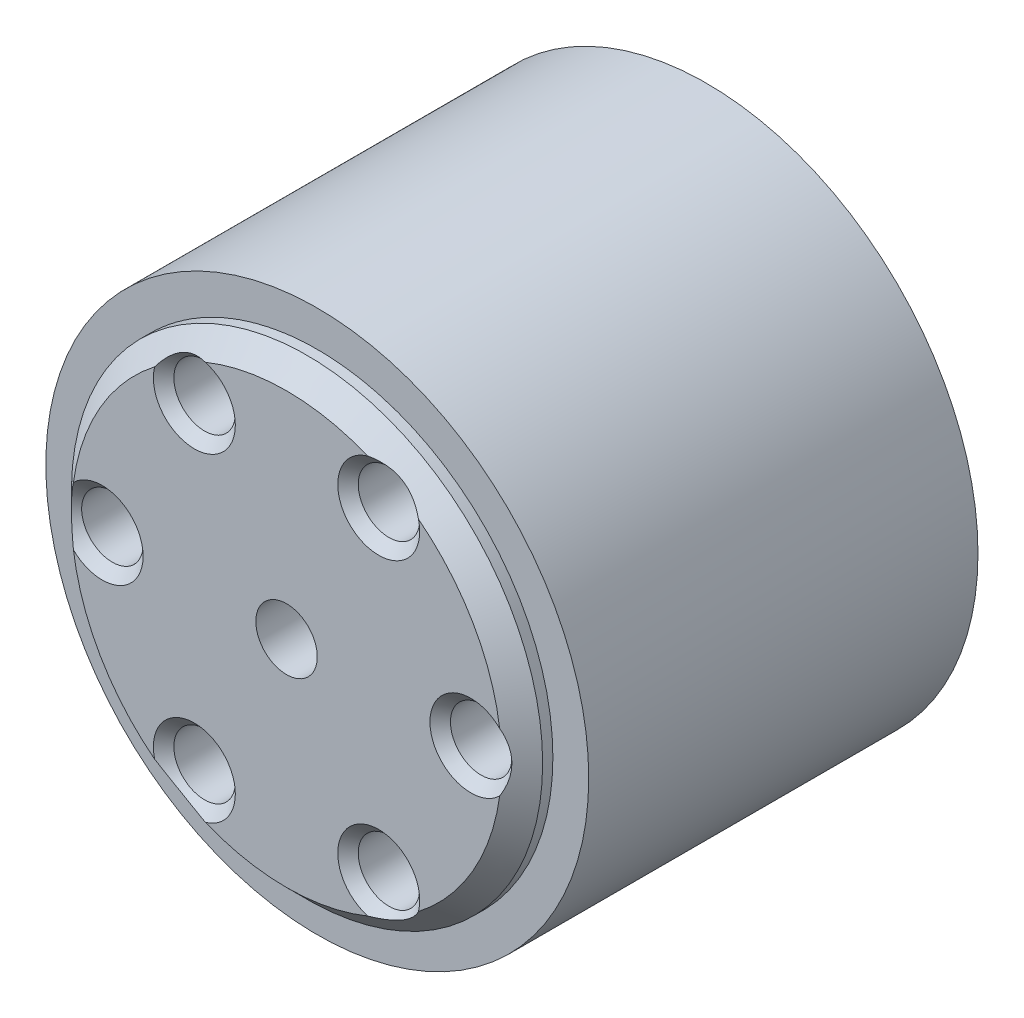
ISO-10303-21;
HEADER;
FILE_DESCRIPTION(('STEP AP214'),'2;1');
FILE_NAME('part.step','',(''),(''),'','','');
FILE_SCHEMA(('AUTOMOTIVE_DESIGN { 1 0 10303 214 1 1 1 1 }'));
ENDSEC;
DATA;
#1=APPLICATION_CONTEXT('core data for automotive mechanical design processes');
#2=APPLICATION_PROTOCOL_DEFINITION('international standard','automotive_design',2000,#1);
#3=PRODUCT_CONTEXT('',#1,'mechanical');
#4=PRODUCT('Part','Part','',(#3));
#5=PRODUCT_RELATED_PRODUCT_CATEGORY('part','',(#4));
#6=PRODUCT_DEFINITION_FORMATION('','',#4);
#7=PRODUCT_DEFINITION_CONTEXT('part definition',#1,'design');
#8=PRODUCT_DEFINITION('design','',#6,#7);
#9=PRODUCT_DEFINITION_SHAPE('','',#8);
#10=(LENGTH_UNIT() NAMED_UNIT(*) SI_UNIT(.MILLI.,.METRE.));
#11=(NAMED_UNIT(*) PLANE_ANGLE_UNIT() SI_UNIT($,.RADIAN.));
#12=(NAMED_UNIT(*) SI_UNIT($,.STERADIAN.) SOLID_ANGLE_UNIT());
#13=UNCERTAINTY_MEASURE_WITH_UNIT(LENGTH_MEASURE(1.E-05),#10,'distance_accuracy_value','');
#14=(GEOMETRIC_REPRESENTATION_CONTEXT(3) GLOBAL_UNCERTAINTY_ASSIGNED_CONTEXT((#13)) GLOBAL_UNIT_ASSIGNED_CONTEXT((#10,
#11,#12)) REPRESENTATION_CONTEXT('',''));
#15=CARTESIAN_POINT('',(0.,0.,0.));
#16=DIRECTION('',(0.,0.,1.));
#17=DIRECTION('',(1.,0.,0.));
#18=AXIS2_PLACEMENT_3D('',#15,#16,#17);
#19=CARTESIAN_POINT('',(0.,0.,9.5));
#20=DIRECTION('',(0.,0.,1.));
#21=DIRECTION('',(1.,0.,0.));
#22=AXIS2_PLACEMENT_3D('',#19,#20,#21);
#23=PLANE('',#22);
#24=CARTESIAN_POINT('',(0.,0.,9.5));
#25=DIRECTION('',(0.,0.,1.));
#26=DIRECTION('',(1.,0.,0.));
#27=AXIS2_PLACEMENT_3D('',#24,#25,#26);
#28=CIRCLE('',#27,13.25);
#29=CARTESIAN_POINT('',(13.25,0.,9.5));
#30=VERTEX_POINT('',#29);
#31=EDGE_CURVE('E11',#30,#30,#28,.T.);
#32=ORIENTED_EDGE('',*,*,#31,.T.);
#33=EDGE_LOOP('',(#32));
#34=FACE_BOUND('',#33,.T.);
#35=CARTESIAN_POINT('',(0.,0.,9.5));
#36=DIRECTION('',(0.,0.,1.));
#37=DIRECTION('',(1.,0.,0.));
#38=AXIS2_PLACEMENT_3D('',#35,#36,#37);
#39=CIRCLE('',#38,11.5);
#40=CARTESIAN_POINT('',(11.5,0.,9.5));
#41=VERTEX_POINT('',#40);
#42=EDGE_CURVE('E55',#41,#41,#39,.T.);
#43=ORIENTED_EDGE('',*,*,#42,.F.);
#44=EDGE_LOOP('',(#43));
#45=FACE_BOUND('',#44,.T.);
#46=ADVANCED_FACE('F44',(#34,#45),#23,.T.);
#47=CARTESIAN_POINT('',(0.,0.,-9.5));
#48=DIRECTION('',(0.,0.,1.));
#49=DIRECTION('',(1.,0.,0.));
#50=AXIS2_PLACEMENT_3D('',#47,#48,#49);
#51=PLANE('',#50);
#52=CARTESIAN_POINT('',(0.,0.,-9.5));
#53=DIRECTION('',(0.,0.,1.));
#54=DIRECTION('',(1.,0.,0.));
#55=AXIS2_PLACEMENT_3D('',#52,#53,#54);
#56=CIRCLE('',#55,13.25);
#57=CARTESIAN_POINT('',(13.25,0.,-9.5));
#58=VERTEX_POINT('',#57);
#59=EDGE_CURVE('E48',#58,#58,#56,.T.);
#60=ORIENTED_EDGE('',*,*,#59,.F.);
#61=EDGE_LOOP('',(#60));
#62=FACE_BOUND('',#61,.T.);
#63=CARTESIAN_POINT('',(0.,0.,-9.5));
#64=DIRECTION('',(0.,0.,1.));
#65=DIRECTION('',(1.,0.,0.));
#66=AXIS2_PLACEMENT_3D('',#63,#64,#65);
#67=CIRCLE('',#66,11.5);
#68=CARTESIAN_POINT('',(11.5,0.,-9.5));
#69=VERTEX_POINT('',#68);
#70=EDGE_CURVE('E57',#69,#69,#67,.T.);
#71=ORIENTED_EDGE('',*,*,#70,.T.);
#72=EDGE_LOOP('',(#71));
#73=FACE_BOUND('',#72,.T.);
#74=ADVANCED_FACE('F67',(#62,#73),#51,.F.);
#75=CARTESIAN_POINT('',(0.,0.,9.5));
#76=DIRECTION('',(0.,0.,-1.));
#77=DIRECTION('',(-1.,0.,0.));
#78=AXIS2_PLACEMENT_3D('',#75,#76,#77);
#79=CYLINDRICAL_SURFACE('',#78,13.25);
#80=ORIENTED_EDGE('',*,*,#31,.F.);
#81=EDGE_LOOP('',(#80));
#82=FACE_BOUND('',#81,.T.);
#83=ORIENTED_EDGE('',*,*,#59,.T.);
#84=EDGE_LOOP('',(#83));
#85=FACE_BOUND('',#84,.T.);
#86=ADVANCED_FACE('F46',(#82,#85),#79,.T.);
#87=CARTESIAN_POINT('',(0.,0.,9.5));
#88=DIRECTION('',(0.,0.,-1.));
#89=DIRECTION('',(-1.,0.,0.));
#90=AXIS2_PLACEMENT_3D('',#87,#88,#89);
#91=CYLINDRICAL_SURFACE('',#90,11.5);
#92=ORIENTED_EDGE('',*,*,#42,.T.);
#93=EDGE_LOOP('',(#92));
#94=FACE_BOUND('',#93,.T.);
#95=ORIENTED_EDGE('',*,*,#70,.F.);
#96=EDGE_LOOP('',(#95));
#97=FACE_BOUND('',#96,.T.);
#98=ADVANCED_FACE('F63',(#94,#97),#91,.F.);
#99=CLOSED_SHELL('',(#46,#74,#86,#98));
#100=MANIFOLD_SOLID_BREP('B2',#99);
#101=CARTESIAN_POINT('',(0.,0.,11.));
#102=DIRECTION('',(0.,0.,-1.));
#103=DIRECTION('',(-1.,0.,0.));
#104=AXIS2_PLACEMENT_3D('',#101,#102,#103);
#105=CYLINDRICAL_SURFACE('',#104,11.5);
#106=CARTESIAN_POINT('',(0.,0.,-10.));
#107=DIRECTION('',(0.,0.,1.));
#108=DIRECTION('',(1.,0.,0.));
#109=AXIS2_PLACEMENT_3D('',#106,#107,#108);
#110=CIRCLE('',#109,11.5);
#111=CARTESIAN_POINT('',(11.5,0.,-10.));
#112=VERTEX_POINT('',#111);
#113=EDGE_CURVE('E263',#112,#112,#110,.T.);
#114=ORIENTED_EDGE('',*,*,#113,.T.);
#115=EDGE_LOOP('',(#114));
#116=FACE_BOUND('',#115,.T.);
#117=CARTESIAN_POINT('',(0.,0.,10.));
#118=DIRECTION('',(0.,0.,1.));
#119=DIRECTION('',(1.,0.,0.));
#120=AXIS2_PLACEMENT_3D('',#117,#118,#119);
#121=CIRCLE('',#120,11.5);
#122=CARTESIAN_POINT('',(11.5,0.,10.));
#123=VERTEX_POINT('',#122);
#124=EDGE_CURVE('E252',#123,#123,#121,.F.);
#125=ORIENTED_EDGE('',*,*,#124,.T.);
#126=EDGE_LOOP('',(#125));
#127=FACE_BOUND('',#126,.T.);
#128=ADVANCED_FACE('F105',(#116,#127),#105,.T.);
#129=CARTESIAN_POINT('',(0.,0.,11.));
#130=DIRECTION('',(0.,0.,1.));
#131=DIRECTION('',(1.,0.,0.));
#132=AXIS2_PLACEMENT_3D('',#129,#130,#131);
#133=PLANE('',#132);
#134=CARTESIAN_POINT('',(0.,0.,11.));
#135=DIRECTION('',(0.,0.,-1.));
#136=DIRECTION('',(-1.,0.,0.));
#137=AXIS2_PLACEMENT_3D('',#134,#135,#136);
#138=CIRCLE('',#137,1.5);
#139=CARTESIAN_POINT('',(-1.5,0.,11.));
#140=VERTEX_POINT('',#139);
#141=EDGE_CURVE('E260',#140,#140,#138,.T.);
#142=ORIENTED_EDGE('',*,*,#141,.T.);
#143=EDGE_LOOP('',(#142));
#144=FACE_BOUND('',#143,.T.);
#145=CARTESIAN_POINT('',(0.,0.,11.));
#146=DIRECTION('',(0.,0.,1.));
#147=DIRECTION('',(1.,0.,0.));
#148=AXIS2_PLACEMENT_3D('',#145,#146,#147);
#149=CIRCLE('',#148,10.5);
#150=CARTESIAN_POINT('',(10.4027777777778,1.42555761236538,11.));
#151=VERTEX_POINT('',#150);
#152=CARTESIAN_POINT('',(6.4359579957557,8.29629101929702,11.));
#153=VERTEX_POINT('',#152);
#154=EDGE_CURVE('E222',#151,#153,#149,.T.);
#155=ORIENTED_EDGE('',*,*,#154,.T.);
#156=CARTESIAN_POINT('',(4.50000000000009,7.79422863405989,11.));
#157=DIRECTION('',(0.,0.,1.));
#158=DIRECTION('',(1.,0.,0.));
#159=AXIS2_PLACEMENT_3D('',#156,#157,#158);
#160=CIRCLE('',#159,2.00000000000002);
#161=CARTESIAN_POINT('',(3.96681978202229,9.72184863166244,11.));
#162=VERTEX_POINT('',#161);
#163=EDGE_CURVE('E402',#153,#162,#160,.F.);
#164=ORIENTED_EDGE('',*,*,#163,.T.);
#165=CARTESIAN_POINT('',(-3.96681978202208,9.72184863166252,11.));
#166=VERTEX_POINT('',#165);
#167=EDGE_CURVE('E270',#162,#166,#149,.T.);
#168=ORIENTED_EDGE('',*,*,#167,.T.);
#169=CARTESIAN_POINT('',(-4.49999999999993,7.79422863405999,11.));
#170=DIRECTION('',(0.,0.,1.));
#171=DIRECTION('',(1.,0.,0.));
#172=AXIS2_PLACEMENT_3D('',#169,#170,#171);
#173=CIRCLE('',#172,2.00000000000002);
#174=CARTESIAN_POINT('',(-6.43595799575553,8.29629101929715,11.));
#175=VERTEX_POINT('',#174);
#176=EDGE_CURVE('E416',#166,#175,#173,.F.);
#177=ORIENTED_EDGE('',*,*,#176,.T.);
#178=CARTESIAN_POINT('',(-10.4027777777778,1.42555761236546,11.));
#179=VERTEX_POINT('',#178);
#180=EDGE_CURVE('E272',#175,#179,#149,.T.);
#181=ORIENTED_EDGE('',*,*,#180,.T.);
#182=CARTESIAN_POINT('',(-9.,0.,11.));
#183=DIRECTION('',(0.,0.,1.));
#184=DIRECTION('',(1.,0.,0.));
#185=AXIS2_PLACEMENT_3D('',#182,#183,#184);
#186=CIRCLE('',#185,2.00000000000002);
#187=CARTESIAN_POINT('',(-10.4027777777778,-1.42555761236531,11.));
#188=VERTEX_POINT('',#187);
#189=EDGE_CURVE('E414',#179,#188,#186,.F.);
#190=ORIENTED_EDGE('',*,*,#189,.T.);
#191=CARTESIAN_POINT('',(-6.43595799575565,-8.29629101929706,11.));
#192=VERTEX_POINT('',#191);
#193=EDGE_CURVE('E693',#188,#192,#149,.T.);
#194=ORIENTED_EDGE('',*,*,#193,.T.);
#195=CARTESIAN_POINT('',(-4.50000000000004,-7.79422863405993,11.));
#196=DIRECTION('',(0.,0.,1.));
#197=DIRECTION('',(1.,0.,0.));
#198=AXIS2_PLACEMENT_3D('',#195,#196,#197);
#199=CIRCLE('',#198,2.00000000000002);
#200=CARTESIAN_POINT('',(-3.96681978202221,-9.72184863166247,11.));
#201=VERTEX_POINT('',#200);
#202=EDGE_CURVE('E411',#192,#201,#199,.F.);
#203=ORIENTED_EDGE('',*,*,#202,.T.);
#204=CARTESIAN_POINT('',(3.96681978202215,-9.72184863166249,11.));
#205=VERTEX_POINT('',#204);
#206=EDGE_CURVE('E691',#201,#205,#149,.T.);
#207=ORIENTED_EDGE('',*,*,#206,.T.);
#208=CARTESIAN_POINT('',(4.49999999999998,-7.79422863405996,11.));
#209=DIRECTION('',(0.,0.,1.));
#210=DIRECTION('',(1.,0.,0.));
#211=AXIS2_PLACEMENT_3D('',#208,#209,#210);
#212=CIRCLE('',#211,2.00000000000002);
#213=CARTESIAN_POINT('',(6.43595799575558,-8.29629101929711,11.));
#214=VERTEX_POINT('',#213);
#215=EDGE_CURVE('E408',#205,#214,#212,.F.);
#216=ORIENTED_EDGE('',*,*,#215,.T.);
#217=CARTESIAN_POINT('',(10.4027777777778,-1.42555761236539,11.));
#218=VERTEX_POINT('',#217);
#219=EDGE_CURVE('E269',#214,#218,#149,.T.);
#220=ORIENTED_EDGE('',*,*,#219,.T.);
#221=CARTESIAN_POINT('',(9.,0.,11.));
#222=DIRECTION('',(0.,0.,1.));
#223=DIRECTION('',(1.,0.,0.));
#224=AXIS2_PLACEMENT_3D('',#221,#222,#223);
#225=CIRCLE('',#224,2.00000000000002);
#226=EDGE_CURVE('E405',#218,#151,#225,.F.);
#227=ORIENTED_EDGE('',*,*,#226,.T.);
#228=EDGE_LOOP('',(#155,#164,#168,#177,#181,#190,#194,#203,#207,#216,#220,#227));
#229=FACE_BOUND('',#228,.T.);
#230=ADVANCED_FACE('F364',(#144,#229),#133,.T.);
#231=CARTESIAN_POINT('',(0.,0.,-11.));
#232=DIRECTION('',(0.,0.,1.));
#233=DIRECTION('',(1.,0.,0.));
#234=AXIS2_PLACEMENT_3D('',#231,#232,#233);
#235=PLANE('',#234);
#236=CARTESIAN_POINT('',(0.,0.,-11.));
#237=DIRECTION('',(0.,0.,-1.));
#238=DIRECTION('',(-1.,0.,0.));
#239=AXIS2_PLACEMENT_3D('',#236,#237,#238);
#240=CIRCLE('',#239,9.);
#241=CARTESIAN_POINT('',(-9.,0.,-11.));
#242=VERTEX_POINT('',#241);
#243=EDGE_CURVE('E256',#242,#242,#240,.T.);
#244=ORIENTED_EDGE('',*,*,#243,.F.);
#245=EDGE_LOOP('',(#244));
#246=FACE_BOUND('',#245,.T.);
#247=CARTESIAN_POINT('',(0.,0.,-11.));
#248=DIRECTION('',(0.,0.,1.));
#249=DIRECTION('',(1.,0.,0.));
#250=AXIS2_PLACEMENT_3D('',#247,#248,#249);
#251=CIRCLE('',#250,10.5);
#252=CARTESIAN_POINT('',(10.5,0.,-11.));
#253=VERTEX_POINT('',#252);
#254=EDGE_CURVE('E266',#253,#253,#251,.F.);
#255=ORIENTED_EDGE('',*,*,#254,.T.);
#256=EDGE_LOOP('',(#255));
#257=FACE_BOUND('',#256,.T.);
#258=ADVANCED_FACE('F369',(#246,#257),#235,.F.);
#259=CARTESIAN_POINT('',(0.,0.,-10.));
#260=DIRECTION('',(0.,0.,1.));
#261=DIRECTION('',(1.,0.,0.));
#262=AXIS2_PLACEMENT_3D('',#259,#260,#261);
#263=CONICAL_SURFACE('',#262,11.5,0.785398163397452);
#264=ORIENTED_EDGE('',*,*,#254,.F.);
#265=EDGE_LOOP('',(#264));
#266=FACE_BOUND('',#265,.T.);
#267=ORIENTED_EDGE('',*,*,#113,.F.);
#268=EDGE_LOOP('',(#267));
#269=FACE_BOUND('',#268,.T.);
#270=ADVANCED_FACE('F302',(#266,#269),#263,.T.);
#271=CARTESIAN_POINT('',(0.,0.,11.));
#272=DIRECTION('',(0.,0.,-1.));
#273=DIRECTION('',(-1.,0.,0.));
#274=AXIS2_PLACEMENT_3D('',#271,#272,#273);
#275=CONICAL_SURFACE('',#274,10.5,0.785398163397447);
#276=ORIENTED_EDGE('',*,*,#124,.F.);
#277=EDGE_LOOP('',(#276));
#278=FACE_BOUND('',#277,.T.);
#279=CARTESIAN_POINT('',(3.96681978202229,9.72184863166244,11.));
#280=CARTESIAN_POINT('',(4.04800281742919,9.71708165853787,10.9737464977825));
#281=CARTESIAN_POINT('',(4.129597876628,9.70947056767909,10.9491180830765));
#282=CARTESIAN_POINT('',(4.29319020898814,9.68814308342982,10.9035233463946));
#283=CARTESIAN_POINT('',(4.37518796533276,9.67441406316904,10.8825647238095));
#284=CARTESIAN_POINT('',(4.53868487648016,9.64047863325514,10.8448658756768));
#285=CARTESIAN_POINT('',(4.62018463735494,9.62028314003418,10.8281186251295));
#286=CARTESIAN_POINT('',(4.78196835962985,9.57317895408099,10.7992477487316));
#287=CARTESIAN_POINT('',(4.86225360244667,9.54627794932121,10.7871188678258));
#288=CARTESIAN_POINT('',(5.01607259250162,9.48750071816903,10.7683938856325));
#289=CARTESIAN_POINT('',(5.08972225209296,9.45602027643994,10.7615092690043));
#290=CARTESIAN_POINT('',(5.23445067103401,9.38720677220278,10.7523148930201));
#291=CARTESIAN_POINT('',(5.30553195692914,9.34987966533036,10.7500005105408));
#292=CARTESIAN_POINT('',(5.4352411310646,9.27499356742143,10.7499995572704));
#293=CARTESIAN_POINT('',(5.49426910837331,9.23812389274586,10.7517391392851));
#294=CARTESIAN_POINT('',(5.60952052427499,9.16048653029115,10.7586584980699));
#295=CARTESIAN_POINT('',(5.66574301539138,9.11971753900176,10.7638394287204));
#296=CARTESIAN_POINT('',(5.77518531628629,9.0345388178329,10.777552394604));
#297=CARTESIAN_POINT('',(5.82839605906454,8.99011898897704,10.786093991054));
#298=CARTESIAN_POINT('',(5.93140703657069,8.89815566987191,10.8063526897249));
#299=CARTESIAN_POINT('',(5.98120634767565,8.85061134045764,10.8180706477018));
#300=CARTESIAN_POINT('',(6.10647601244806,8.72305303763125,10.852511054591));
#301=CARTESIAN_POINT('',(6.17913714882577,8.64087890467324,10.8775917638527));
#302=CARTESIAN_POINT('',(6.28086142669633,8.5139788406267,10.920098072833));
#303=CARTESIAN_POINT('',(6.31348393324186,8.47118656656455,10.9350365919063));
#304=CARTESIAN_POINT('',(6.37642637410579,8.38451771869897,10.9664186584596));
#305=CARTESIAN_POINT('',(6.40674773242467,8.34064183810947,10.9828612610541));
#306=CARTESIAN_POINT('',(6.4359579957557,8.29629101929702,11.));
#307=B_SPLINE_CURVE_WITH_KNOTS('',3,(#279,#280,#281,#282,#283,#284,#285,#286,#287,#288,#289,
#290,#291,#292,#293,#294,#295,#296,#297,#298,#299,#300,#301,#302,#303,#304,#305,#306),
.UNSPECIFIED.,.F.,.F.,(4,2,2,2,2,2,2,2,2,2,2,2,2,4),(0.,0.25638001445752,0.513291643370057,
0.769771831303789,1.02595930250082,1.26676216928416,1.50732132146954,1.71592883040358,
1.92460632052751,2.13388184936356,2.3432138160649,2.67986879906656,2.84734051050619,
3.01470772716207),.UNSPECIFIED.);
#308=EDGE_CURVE('E333',#162,#153,#307,.T.);
#309=ORIENTED_EDGE('',*,*,#308,.T.);
#310=ORIENTED_EDGE('',*,*,#154,.F.);
#311=CARTESIAN_POINT('',(10.4027777777778,1.42555761236538,11.));
#312=CARTESIAN_POINT('',(10.4392409756562,1.35286755478439,10.9737464977825));
#313=CARTESIAN_POINT('',(10.4734471072214,1.27839861526554,10.9491180830765));
#314=CARTESIAN_POINT('',(10.5367731302428,1.12605975745268,10.9035233463946));
#315=CARTESIAN_POINT('',(10.5658823281002,1.04818310727452,10.8825647238095));
#316=CARTESIAN_POINT('',(10.6182418392801,0.889622913823632,10.8448658756768));
#317=CARTESIAN_POINT('',(10.6415019095462,0.808944303893245,10.8281186251295));
#318=CARTESIAN_POINT('',(10.6816003490236,0.645283397507766,10.7992477487316));
#319=CARTESIAN_POINT('',(10.6984460169227,0.562303835299508,10.7871188678258));
#320=CARTESIAN_POINT('',(10.7244529366083,0.39970406675137,10.7683938856325));
#321=CARTESIAN_POINT('',(10.7340149041442,0.320181369700649,10.7615092690043));
#322=CARTESIAN_POINT('',(10.7467848708219,0.160436130129566,10.7523148930201));
#323=CARTESIAN_POINT('',(10.7499992909682,0.0802143773745032,10.7500005105408));
#324=CARTESIAN_POINT('',(10.7500006148565,-0.0695601114851643,10.7499995572704));
#325=CARTESIAN_POINT('',(10.7475845286126,-0.139114676706311,10.7517391392851));
#326=CARTESIAN_POINT('',(10.7379743083948,-0.277744011926639,10.7586584980699));
#327=CARTESIAN_POINT('',(10.7307785718097,-0.346818613142174,10.7638394287204));
#328=CARTESIAN_POINT('',(10.7117327858631,-0.484187786550213,10.777552394604));
#329=CARTESIAN_POINT('',(10.6998694570313,-0.552479555978352,10.786093991054));
#330=CARTESIAN_POINT('',(10.671732375223,-0.687671338919907,10.8063526897249));
#331=CARTESIAN_POINT('',(10.6554574336968,-0.754570972134905,10.8180706477018));
#332=CARTESIAN_POINT('',(10.6076235353717,-0.92683683556457,10.852511054591));
#333=CARTESIAN_POINT('',(10.572789216885,-1.03085029201451,10.8775917638527));
#334=CARTESIAN_POINT('',(10.5137526766141,-1.18239613285532,10.920098072833));
#335=CARTESIAN_POINT('',(10.4930047334633,-1.23204418928995,10.9350365919063));
#336=CARTESIAN_POINT('',(10.449418529927,-1.3298883659871,10.9664186584596));
#337=CARTESIAN_POINT('',(10.4265815818825,-1.37808537286325,10.9828612610541));
#338=CARTESIAN_POINT('',(10.4027777777778,-1.42555761236539,11.));
#339=B_SPLINE_CURVE_WITH_KNOTS('',3,(#311,#312,#313,#314,#315,#316,#317,#318,#319,#320,#321,
#322,#323,#324,#325,#326,#327,#328,#329,#330,#331,#332,#333,#334,#335,#336,#337,#338),
.UNSPECIFIED.,.F.,.F.,(4,2,2,2,2,2,2,2,2,2,2,2,2,4),(0.,0.256380014457518,0.513291643370053,
0.769771831303782,1.02595930250082,1.26676216928415,1.50732132146953,1.71592883040357,
1.9246063205275,2.13388184936355,2.34321381606488,2.67986879906654,2.84734051050617,
3.01470772716206),.UNSPECIFIED.);
#340=EDGE_CURVE('E327',#151,#218,#339,.T.);
#341=ORIENTED_EDGE('',*,*,#340,.T.);
#342=ORIENTED_EDGE('',*,*,#219,.F.);
#343=CARTESIAN_POINT('',(6.43595799575558,-8.29629101929711,11.));
#344=CARTESIAN_POINT('',(6.3912381582271,-8.36421410375354,10.9737464977825));
#345=CARTESIAN_POINT('',(6.34384923059349,-8.43107195241361,10.9491180830765));
#346=CARTESIAN_POINT('',(6.24358292125474,-8.56208332597721,10.9035233463946));
#347=CARTESIAN_POINT('',(6.19069436276752,-8.62623095589458,10.8825647238095));
#348=CARTESIAN_POINT('',(6.07955696280004,-8.75085571943157,10.8448658756768));
#349=CARTESIAN_POINT('',(6.02131727219135,-8.811338836141,10.8281186251295));
#350=CARTESIAN_POINT('',(5.89963198939384,-8.92789555657329,10.7992477487316));
#351=CARTESIAN_POINT('',(5.83619241447613,-8.98397411402177,10.7871188678258));
#352=CARTESIAN_POINT('',(5.70838034410676,-9.08779665141773,10.7683938856325));
#353=CARTESIAN_POINT('',(5.64429265205134,-9.13583890673936,10.7615092690043));
#354=CARTESIAN_POINT('',(5.51233419978801,-9.22677064207329,10.7523148930201));
#355=CARTESIAN_POINT('',(5.44446733403915,-9.26966528795592,10.7500005105408));
#356=CARTESIAN_POINT('',(5.31475948379201,-9.34455367890667,10.7499995572704));
#357=CARTESIAN_POINT('',(5.25331542023933,-9.37723856945225,10.7517391392851));
#358=CARTESIAN_POINT('',(5.1284537841199,-9.43823054221786,10.7586584980699));
#359=CARTESIAN_POINT('',(5.06503555641843,-9.46653615214402,10.7638394287204));
#360=CARTESIAN_POINT('',(4.93654746957687,-9.5187266043832,10.777552394604));
#361=CARTESIAN_POINT('',(4.87147339796681,-9.54259854495548,10.786093991054));
#362=CARTESIAN_POINT('',(4.74032533865236,-9.5858270087919,10.8063526897249));
#363=CARTESIAN_POINT('',(4.67425108602123,-9.60518231259263,10.8180706477018));
#364=CARTESIAN_POINT('',(4.50114752292374,-9.6498898731959,10.852511054591));
#365=CARTESIAN_POINT('',(4.39365206805929,-9.67172919668784,10.8775917638527));
#366=CARTESIAN_POINT('',(4.23289124991783,-9.6963749734821,10.920098072833));
#367=CARTESIAN_POINT('',(4.17952080022154,-9.70323075585458,10.9350365919063));
#368=CARTESIAN_POINT('',(4.07299215582125,-9.71440608468615,10.9664186584596));
#369=CARTESIAN_POINT('',(4.01983384945789,-9.7187272109728,10.9828612610541));
#370=CARTESIAN_POINT('',(3.96681978202215,-9.72184863166249,11.));
#371=B_SPLINE_CURVE_WITH_KNOTS('',3,(#343,#344,#345,#346,#347,#348,#349,#350,#351,#352,#353,
#354,#355,#356,#357,#358,#359,#360,#361,#362,#363,#364,#365,#366,#367,#368,#369,#370),
.UNSPECIFIED.,.F.,.F.,(4,2,2,2,2,2,2,2,2,2,2,2,2,4),(0.,0.256380014457517,0.513291643370051,
0.76977183130378,1.02595930250082,1.26676216928415,1.50732132146953,1.71592883040358,
1.9246063205275,2.13388184936355,2.34321381606488,2.67986879906655,2.84734051050618,
3.01470772716207),.UNSPECIFIED.);
#372=EDGE_CURVE('E320',#214,#205,#371,.T.);
#373=ORIENTED_EDGE('',*,*,#372,.T.);
#374=ORIENTED_EDGE('',*,*,#206,.F.);
#375=CARTESIAN_POINT('',(-3.96681978202222,-9.72184863166247,11.));
#376=CARTESIAN_POINT('',(-4.04800281742912,-9.7170816585379,10.9737464977825));
#377=CARTESIAN_POINT('',(-4.12959787662793,-9.70947056767912,10.9491180830765));
#378=CARTESIAN_POINT('',(-4.29319020898807,-9.68814308342986,10.9035233463946));
#379=CARTESIAN_POINT('',(-4.37518796533268,-9.67441406316907,10.8825647238095));
#380=CARTESIAN_POINT('',(-4.53868487648009,-9.64047863325518,10.8448658756768));
#381=CARTESIAN_POINT('',(-4.62018463735486,-9.62028314003422,10.8281186251295));
#382=CARTESIAN_POINT('',(-4.78196835962978,-9.57317895408103,10.7992477487316));
#383=CARTESIAN_POINT('',(-4.8622536024466,-9.54627794932125,10.7871188678258));
#384=CARTESIAN_POINT('',(-5.01607259250155,-9.48750071816907,10.7683938856325));
#385=CARTESIAN_POINT('',(-5.08972225209289,-9.45602027643998,10.7615092690043));
#386=CARTESIAN_POINT('',(-5.23445067103394,-9.38720677220282,10.7523148930201));
#387=CARTESIAN_POINT('',(-5.30553195692907,-9.34987966533039,10.7500005105408));
#388=CARTESIAN_POINT('',(-5.43524113106453,-9.27499356742147,10.7499995572704));
#389=CARTESIAN_POINT('',(-5.49426910837325,-9.2381238927459,10.7517391392851));
#390=CARTESIAN_POINT('',(-5.60952052427492,-9.16048653029119,10.7586584980699));
#391=CARTESIAN_POINT('',(-5.66574301539132,-9.11971753900181,10.7638394287204));
#392=CARTESIAN_POINT('',(-5.77518531628622,-9.03453881783295,10.777552394604));
#393=CARTESIAN_POINT('',(-5.82839605906448,-8.99011898897709,10.786093991054));
#394=CARTESIAN_POINT('',(-5.93140703657063,-8.89815566987196,10.8063526897249));
#395=CARTESIAN_POINT('',(-5.98120634767559,-8.85061134045769,10.8180706477018));
#396=CARTESIAN_POINT('',(-6.106476012448,-8.72305303763129,10.852511054591));
#397=CARTESIAN_POINT('',(-6.1791371488257,-8.64087890467329,10.8775917638527));
#398=CARTESIAN_POINT('',(-6.28086142669627,-8.51397884062674,10.920098072833));
#399=CARTESIAN_POINT('',(-6.3134839332418,-8.47118656656459,10.9350365919062));
#400=CARTESIAN_POINT('',(-6.37642637410573,-8.38451771869901,10.9664186584596));
#401=CARTESIAN_POINT('',(-6.40674773242461,-8.34064183810951,10.9828612610541));
#402=CARTESIAN_POINT('',(-6.43595799575565,-8.29629101929706,11.));
#403=B_SPLINE_CURVE_WITH_KNOTS('',3,(#375,#376,#377,#378,#379,#380,#381,#382,#383,#384,#385,
#386,#387,#388,#389,#390,#391,#392,#393,#394,#395,#396,#397,#398,#399,#400,#401,#402),
.UNSPECIFIED.,.F.,.F.,(4,2,2,2,2,2,2,2,2,2,2,2,2,4),(0.,0.25638001445752,0.513291643370058,
0.769771831303789,1.02595930250083,1.26676216928416,1.50732132146954,1.71592883040359,
1.92460632052752,2.13388184936356,2.3432138160649,2.67986879906656,2.84734051050619,
3.01470772716208),.UNSPECIFIED.);
#404=EDGE_CURVE('E313',#201,#192,#403,.T.);
#405=ORIENTED_EDGE('',*,*,#404,.T.);
#406=ORIENTED_EDGE('',*,*,#193,.F.);
#407=CARTESIAN_POINT('',(-10.4027777777778,-1.42555761236531,11.));
#408=CARTESIAN_POINT('',(-10.4392409756562,-1.35286755478431,10.9737464977825));
#409=CARTESIAN_POINT('',(-10.4734471072214,-1.27839861526547,10.9491180830765));
#410=CARTESIAN_POINT('',(-10.5367731302428,-1.12605975745261,10.9035233463946));
#411=CARTESIAN_POINT('',(-10.5658823281002,-1.04818310727445,10.8825647238095));
#412=CARTESIAN_POINT('',(-10.6182418392801,-0.889622913823561,10.8448658756768));
#413=CARTESIAN_POINT('',(-10.6415019095462,-0.808944303893173,10.8281186251295));
#414=CARTESIAN_POINT('',(-10.6816003490236,-0.645283397507695,10.7992477487316));
#415=CARTESIAN_POINT('',(-10.6984460169227,-0.562303835299437,10.7871188678258));
#416=CARTESIAN_POINT('',(-10.7244529366083,-0.399704066751298,10.7683938856325));
#417=CARTESIAN_POINT('',(-10.7340149041442,-0.320181369700576,10.7615092690043));
#418=CARTESIAN_POINT('',(-10.7467848708219,-0.160436130129493,10.7523148930201));
#419=CARTESIAN_POINT('',(-10.7499992909682,-0.0802143773744297,10.7500005105408));
#420=CARTESIAN_POINT('',(-10.7500006148565,0.069560111485238,10.7499995572704));
#421=CARTESIAN_POINT('',(-10.7475845286126,0.139114676706385,10.7517391392851));
#422=CARTESIAN_POINT('',(-10.7379743083948,0.277744011926712,10.7586584980699));
#423=CARTESIAN_POINT('',(-10.7307785718097,0.346818613142248,10.7638394287204));
#424=CARTESIAN_POINT('',(-10.7117327858631,0.484187786550287,10.777552394604));
#425=CARTESIAN_POINT('',(-10.6998694570313,0.552479555978426,10.786093991054));
#426=CARTESIAN_POINT('',(-10.671732375223,0.687671338919981,10.8063526897249));
#427=CARTESIAN_POINT('',(-10.6554574336968,0.754570972134978,10.8180706477018));
#428=CARTESIAN_POINT('',(-10.6076235353717,0.926836835564643,10.852511054591));
#429=CARTESIAN_POINT('',(-10.572789216885,1.03085029201458,10.8775917638527));
#430=CARTESIAN_POINT('',(-10.5137526766141,1.18239613285539,10.920098072833));
#431=CARTESIAN_POINT('',(-10.4930047334633,1.23204418929002,10.9350365919063));
#432=CARTESIAN_POINT('',(-10.4494185299269,1.32988836598717,10.9664186584596));
#433=CARTESIAN_POINT('',(-10.4265815818825,1.37808537286332,10.9828612610541));
#434=CARTESIAN_POINT('',(-10.4027777777778,1.42555761236546,11.));
#435=B_SPLINE_CURVE_WITH_KNOTS('',3,(#407,#408,#409,#410,#411,#412,#413,#414,#415,#416,#417,
#418,#419,#420,#421,#422,#423,#424,#425,#426,#427,#428,#429,#430,#431,#432,#433,#434),
.UNSPECIFIED.,.F.,.F.,(4,2,2,2,2,2,2,2,2,2,2,2,2,4),(0.,0.256380014457518,0.513291643370053,
0.769771831303781,1.02595930250082,1.26676216928415,1.50732132146953,1.71592883040357,
1.9246063205275,2.13388184936355,2.34321381606488,2.67986879906654,2.84734051050617,
3.01470772716206),.UNSPECIFIED.);
#436=EDGE_CURVE('E291',#188,#179,#435,.T.);
#437=ORIENTED_EDGE('',*,*,#436,.T.);
#438=ORIENTED_EDGE('',*,*,#180,.F.);
#439=CARTESIAN_POINT('',(-6.43595799575553,8.29629101929715,11.));
#440=CARTESIAN_POINT('',(-6.39123815822705,8.36421410375358,10.9737464977825));
#441=CARTESIAN_POINT('',(-6.34384923059343,8.43107195241365,10.9491180830765));
#442=CARTESIAN_POINT('',(-6.24358292125469,8.56208332597724,10.9035233463946));
#443=CARTESIAN_POINT('',(-6.19069436276747,8.62623095589462,10.8825647238095));
#444=CARTESIAN_POINT('',(-6.07955696279998,8.75085571943161,10.8448658756768));
#445=CARTESIAN_POINT('',(-6.02131727219129,8.81133883614104,10.8281186251295));
#446=CARTESIAN_POINT('',(-5.89963198939378,8.92789555657333,10.7992477487316));
#447=CARTESIAN_POINT('',(-5.83619241447608,8.98397411402181,10.7871188678258));
#448=CARTESIAN_POINT('',(-5.70838034410671,9.08779665141777,10.7683938856325));
#449=CARTESIAN_POINT('',(-5.64429265205129,9.1358389067394,10.7615092690043));
#450=CARTESIAN_POINT('',(-5.51233419978796,9.22677064207333,10.7523148930201));
#451=CARTESIAN_POINT('',(-5.44446733403909,9.26966528795596,10.7500005105408));
#452=CARTESIAN_POINT('',(-5.31475948379194,9.34455367890671,10.7499995572704));
#453=CARTESIAN_POINT('',(-5.25331542023927,9.37723856945229,10.7517391392851));
#454=CARTESIAN_POINT('',(-5.12845378411984,9.43823054221791,10.7586584980699));
#455=CARTESIAN_POINT('',(-5.06503555641837,9.46653615214406,10.7638394287204));
#456=CARTESIAN_POINT('',(-4.93654746957681,9.51872660438323,10.777552394604));
#457=CARTESIAN_POINT('',(-4.87147339796675,9.54259854495551,10.786093991054));
#458=CARTESIAN_POINT('',(-4.7403253386523,9.58582700879194,10.8063526897249));
#459=CARTESIAN_POINT('',(-4.67425108602116,9.60518231259267,10.8180706477018));
#460=CARTESIAN_POINT('',(-4.50114752292367,9.64988987319594,10.852511054591));
#461=CARTESIAN_POINT('',(-4.39365206805923,9.67172919668787,10.8775917638527));
#462=CARTESIAN_POINT('',(-4.23289124991776,9.69637497348213,10.920098072833));
#463=CARTESIAN_POINT('',(-4.17952080022146,9.70323075585461,10.9350365919062));
#464=CARTESIAN_POINT('',(-4.07299215582118,9.71440608468618,10.9664186584596));
#465=CARTESIAN_POINT('',(-4.01983384945782,9.71872721097284,10.9828612610541));
#466=CARTESIAN_POINT('',(-3.96681978202208,9.72184863166252,11.));
#467=B_SPLINE_CURVE_WITH_KNOTS('',3,(#439,#440,#441,#442,#443,#444,#445,#446,#447,#448,#449,
#450,#451,#452,#453,#454,#455,#456,#457,#458,#459,#460,#461,#462,#463,#464,#465,#466),
.UNSPECIFIED.,.F.,.F.,(4,2,2,2,2,2,2,2,2,2,2,2,2,4),(0.,0.256380014457521,0.513291643370058,
0.769771831303788,1.02595930250082,1.26676216928416,1.50732132146954,1.71592883040359,
1.92460632052752,2.13388184936357,2.3432138160649,2.67986879906656,2.8473405105062,
3.01470772716209),.UNSPECIFIED.);
#468=EDGE_CURVE('E284',#175,#166,#467,.T.);
#469=ORIENTED_EDGE('',*,*,#468,.T.);
#470=ORIENTED_EDGE('',*,*,#167,.F.);
#471=EDGE_LOOP('',(#309,#310,#341,#342,#373,#374,#405,#406,#437,#438,#469,#470));
#472=FACE_BOUND('',#471,.T.);
#473=ADVANCED_FACE('F297',(#278,#472),#275,.T.);
#474=CARTESIAN_POINT('',(0.,0.,3.5));
#475=DIRECTION('',(0.,0.,-1.));
#476=DIRECTION('',(-1.,0.,0.));
#477=AXIS2_PLACEMENT_3D('',#474,#475,#476);
#478=CYLINDRICAL_SURFACE('',#477,9.);
#479=CARTESIAN_POINT('',(0.,0.,3.5));
#480=DIRECTION('',(0.,0.,-1.));
#481=DIRECTION('',(-1.,0.,0.));
#482=AXIS2_PLACEMENT_3D('',#479,#480,#481);
#483=CIRCLE('',#482,9.);
#484=CARTESIAN_POINT('',(-8.87499999999999,1.49478259288774,3.5));
#485=VERTEX_POINT('',#484);
#486=CARTESIAN_POINT('',(-5.73201969857543,6.93858416214311,3.5));
#487=VERTEX_POINT('',#486);
#488=EDGE_CURVE('E248',#485,#487,#483,.T.);
#489=ORIENTED_EDGE('',*,*,#488,.F.);
#490=CARTESIAN_POINT('',(-8.87500000000001,-1.49478259288761,3.5));
#491=VERTEX_POINT('',#490);
#492=EDGE_CURVE('E259',#491,#485,#483,.T.);
#493=ORIENTED_EDGE('',*,*,#492,.F.);
#494=CARTESIAN_POINT('',(-5.73201969857552,-6.93858416214303,3.5));
#495=VERTEX_POINT('',#494);
#496=EDGE_CURVE('E457',#495,#491,#483,.T.);
#497=ORIENTED_EDGE('',*,*,#496,.F.);
#498=CARTESIAN_POINT('',(-3.14298030142454,-8.43336675503072,3.5));
#499=VERTEX_POINT('',#498);
#500=EDGE_CURVE('E462',#499,#495,#483,.T.);
#501=ORIENTED_EDGE('',*,*,#500,.F.);
#502=CARTESIAN_POINT('',(3.14298030142449,-8.43336675503073,3.5));
#503=VERTEX_POINT('',#502);
#504=EDGE_CURVE('E238',#503,#499,#483,.T.);
#505=ORIENTED_EDGE('',*,*,#504,.F.);
#506=CARTESIAN_POINT('',(5.73201969857548,-6.93858416214307,3.5));
#507=VERTEX_POINT('',#506);
#508=EDGE_CURVE('E227',#507,#503,#483,.T.);
#509=ORIENTED_EDGE('',*,*,#508,.F.);
#510=CARTESIAN_POINT('',(8.875,-1.49478259288767,3.5));
#511=VERTEX_POINT('',#510);
#512=EDGE_CURVE('E236',#511,#507,#483,.T.);
#513=ORIENTED_EDGE('',*,*,#512,.F.);
#514=CARTESIAN_POINT('',(8.875,1.49478259288767,3.5));
#515=VERTEX_POINT('',#514);
#516=EDGE_CURVE('E244',#515,#511,#483,.T.);
#517=ORIENTED_EDGE('',*,*,#516,.F.);
#518=CARTESIAN_POINT('',(6.11021482053672,6.60797055433008,3.5));
#519=VERTEX_POINT('',#518);
#520=EDGE_CURVE('E246',#519,#515,#483,.T.);
#521=ORIENTED_EDGE('',*,*,#520,.F.);
#522=CARTESIAN_POINT('',(6.11021482053672,6.60797055433008,3.5));
#523=CARTESIAN_POINT('',(6.04867758304427,6.66486962347425,3.58327625945298));
#524=CARTESIAN_POINT('',(5.98639270363181,6.7208702924461,3.66658105649593));
#525=CARTESIAN_POINT('',(5.86032766293149,6.83107482832773,3.83324772316438));
#526=CARTESIAN_POINT('',(5.79654750169023,6.88527869529352,3.91660959278811));
#527=CARTESIAN_POINT('',(5.73201969857558,6.93858416214299,4.00000000000002));
#528=B_SPLINE_CURVE_WITH_KNOTS('',3,(#522,#523,#524,#525,#526,#527),.UNSPECIFIED.,.F.,.F.,(4,2,
4),(0.,0.354396011619444,0.708792012192983),.UNSPECIFIED.);
#529=CARTESIAN_POINT('',(5.73201969857558,6.93858416214299,4.00000000000002));
#530=VERTEX_POINT('',#529);
#531=EDGE_CURVE('E42',#519,#530,#528,.T.);
#532=ORIENTED_EDGE('',*,*,#531,.T.);
#533=DIRECTION('',(0.,0.,-1.));
#534=VECTOR('',#533,1.);
#535=CARTESIAN_POINT('',(5.73201969857558,6.93858416214299,3.5));
#536=LINE('',#535,#534);
#537=CARTESIAN_POINT('',(5.73201969857558,6.93858416214299,3.5));
#538=VERTEX_POINT('',#537);
#539=EDGE_CURVE('E126',#538,#530,#536,.F.);
#540=ORIENTED_EDGE('',*,*,#539,.F.);
#541=CARTESIAN_POINT('',(3.1429803014246,8.43336675503069,3.5));
#542=VERTEX_POINT('',#541);
#543=EDGE_CURVE('E247',#542,#538,#483,.T.);
#544=ORIENTED_EDGE('',*,*,#543,.F.);
#545=DIRECTION('',(0.,0.,-1.));
#546=VECTOR('',#545,1.);
#547=CARTESIAN_POINT('',(3.1429803014246,8.43336675503069,4.00000000000002));
#548=LINE('',#547,#546);
#549=CARTESIAN_POINT('',(3.1429803014246,8.43336675503069,4.00000000000002));
#550=VERTEX_POINT('',#549);
#551=EDGE_CURVE('E279',#550,#542,#548,.T.);
#552=ORIENTED_EDGE('',*,*,#551,.F.);
#553=CARTESIAN_POINT('',(3.1429803014246,8.43336675503069,4.00000000000002));
#554=CARTESIAN_POINT('',(3.06455251141504,8.46259673835365,3.91660959278811));
#555=CARTESIAN_POINT('',(2.98572050501869,8.49073004476316,3.83324772316438));
#556=CARTESIAN_POINT('',(2.82724805698276,8.54480330459794,3.66658105649593));
#557=CARTESIAN_POINT('',(2.74760761531799,8.57074325795486,3.58327625945298));
#558=CARTESIAN_POINT('',(2.66756295724123,8.59558653432995,3.5));
#559=B_SPLINE_CURVE_WITH_KNOTS('',3,(#553,#554,#555,#556,#557,#558),.UNSPECIFIED.,.F.,.F.,(4,2,
4),(0.,0.354396000573539,0.708792012192983),.UNSPECIFIED.);
#560=CARTESIAN_POINT('',(2.66756295724123,8.59558653432995,3.5));
#561=VERTEX_POINT('',#560);
#562=EDGE_CURVE('E120',#550,#561,#559,.T.);
#563=ORIENTED_EDGE('',*,*,#562,.T.);
#564=CARTESIAN_POINT('',(-3.14298030142443,8.43336675503076,3.5));
#565=VERTEX_POINT('',#564);
#566=EDGE_CURVE('E455',#565,#561,#483,.T.);
#567=ORIENTED_EDGE('',*,*,#566,.F.);
#568=EDGE_CURVE('E253',#487,#565,#483,.T.);
#569=ORIENTED_EDGE('',*,*,#568,.F.);
#570=EDGE_LOOP('',(#489,#493,#497,#501,#505,#509,#513,#517,#521,#532,#540,#544,#552,#563,#567,#569));
#571=FACE_BOUND('',#570,.T.);
#572=ORIENTED_EDGE('',*,*,#243,.T.);
#573=EDGE_LOOP('',(#572));
#574=FACE_BOUND('',#573,.T.);
#575=ADVANCED_FACE('F233',(#571,#574),#478,.F.);
#576=CARTESIAN_POINT('',(0.,0.,3.5));
#577=DIRECTION('',(0.,0.,-1.));
#578=DIRECTION('',(-1.,0.,0.));
#579=AXIS2_PLACEMENT_3D('',#576,#577,#578);
#580=PLANE('',#579);
#581=ORIENTED_EDGE('',*,*,#566,.T.);
#582=CARTESIAN_POINT('',(4.50000000000009,7.79422863405989,3.5));
#583=DIRECTION('',(0.,0.,-1.));
#584=DIRECTION('',(-1.,0.,0.));
#585=AXIS2_PLACEMENT_3D('',#582,#583,#584);
#586=CIRCLE('',#585,2.00000000000002);
#587=EDGE_CURVE('E134',#561,#519,#586,.F.);
#588=ORIENTED_EDGE('',*,*,#587,.T.);
#589=ORIENTED_EDGE('',*,*,#520,.T.);
#590=CARTESIAN_POINT('',(9.,0.,3.5));
#591=DIRECTION('',(0.,0.,-1.));
#592=DIRECTION('',(-1.,0.,0.));
#593=AXIS2_PLACEMENT_3D('',#590,#591,#592);
#594=CIRCLE('',#593,1.5);
#595=EDGE_CURVE('E221',#511,#515,#594,.T.);
#596=ORIENTED_EDGE('',*,*,#595,.F.);
#597=ORIENTED_EDGE('',*,*,#512,.T.);
#598=CARTESIAN_POINT('',(4.49999999999998,-7.79422863405996,3.5));
#599=DIRECTION('',(0.,0.,-1.));
#600=DIRECTION('',(-1.,0.,0.));
#601=AXIS2_PLACEMENT_3D('',#598,#599,#600);
#602=CIRCLE('',#601,1.5);
#603=EDGE_CURVE('E213',#503,#507,#602,.T.);
#604=ORIENTED_EDGE('',*,*,#603,.F.);
#605=ORIENTED_EDGE('',*,*,#504,.T.);
#606=CARTESIAN_POINT('',(-4.50000000000004,-7.79422863405993,3.5));
#607=DIRECTION('',(0.,0.,-1.));
#608=DIRECTION('',(-1.,0.,0.));
#609=AXIS2_PLACEMENT_3D('',#606,#607,#608);
#610=CIRCLE('',#609,1.5);
#611=EDGE_CURVE('E229',#499,#495,#610,.F.);
#612=ORIENTED_EDGE('',*,*,#611,.T.);
#613=ORIENTED_EDGE('',*,*,#496,.T.);
#614=CARTESIAN_POINT('',(-9.,0.,3.5));
#615=DIRECTION('',(0.,0.,-1.));
#616=DIRECTION('',(-1.,0.,0.));
#617=AXIS2_PLACEMENT_3D('',#614,#615,#616);
#618=CIRCLE('',#617,1.5);
#619=EDGE_CURVE('E477',#491,#485,#618,.F.);
#620=ORIENTED_EDGE('',*,*,#619,.T.);
#621=ORIENTED_EDGE('',*,*,#488,.T.);
#622=CARTESIAN_POINT('',(-4.49999999999993,7.79422863405999,3.5));
#623=DIRECTION('',(0.,0.,-1.));
#624=DIRECTION('',(-1.,0.,0.));
#625=AXIS2_PLACEMENT_3D('',#622,#623,#624);
#626=CIRCLE('',#625,1.5);
#627=EDGE_CURVE('E475',#487,#565,#626,.F.);
#628=ORIENTED_EDGE('',*,*,#627,.T.);
#629=EDGE_LOOP('',(#581,#588,#589,#596,#597,#604,#605,#612,#613,#620,#621,#628));
#630=FACE_BOUND('',#629,.T.);
#631=CARTESIAN_POINT('',(0.,0.,3.5));
#632=DIRECTION('',(0.,0.,-1.));
#633=DIRECTION('',(-1.,0.,0.));
#634=AXIS2_PLACEMENT_3D('',#631,#632,#633);
#635=CIRCLE('',#634,1.5);
#636=CARTESIAN_POINT('',(-1.5,0.,3.5));
#637=VERTEX_POINT('',#636);
#638=EDGE_CURVE('E254',#637,#637,#635,.T.);
#639=ORIENTED_EDGE('',*,*,#638,.F.);
#640=EDGE_LOOP('',(#639));
#641=FACE_BOUND('',#640,.T.);
#642=ADVANCED_FACE('F241',(#630,#641),#580,.T.);
#643=CARTESIAN_POINT('',(0.,0.,11.));
#644=DIRECTION('',(0.,0.,-1.));
#645=DIRECTION('',(-1.,0.,0.));
#646=AXIS2_PLACEMENT_3D('',#643,#644,#645);
#647=CYLINDRICAL_SURFACE('',#646,1.5);
#648=ORIENTED_EDGE('',*,*,#141,.F.);
#649=EDGE_LOOP('',(#648));
#650=FACE_BOUND('',#649,.T.);
#651=ORIENTED_EDGE('',*,*,#638,.T.);
#652=EDGE_LOOP('',(#651));
#653=FACE_BOUND('',#652,.T.);
#654=ADVANCED_FACE('F510',(#650,#653),#647,.F.);
#655=CARTESIAN_POINT('',(0.,0.,3.5));
#656=DIRECTION('',(0.,0.,-1.));
#657=DIRECTION('',(-1.,0.,0.));
#658=AXIS2_PLACEMENT_3D('',#655,#656,#657);
#659=PLANE('',#658);
#660=CARTESIAN_POINT('',(4.49999999999998,-7.79422863405996,3.5));
#661=DIRECTION('',(0.,0.,-1.));
#662=DIRECTION('',(-1.,0.,0.));
#663=AXIS2_PLACEMENT_3D('',#660,#661,#662);
#664=CIRCLE('',#663,1.5);
#665=EDGE_CURVE('E216',#503,#507,#664,.F.);
#666=ORIENTED_EDGE('',*,*,#665,.T.);
#667=ORIENTED_EDGE('',*,*,#508,.T.);
#668=EDGE_LOOP('',(#666,#667));
#669=FACE_BOUND('',#668,.T.);
#670=ADVANCED_FACE('F226',(#669),#659,.F.);
#671=CARTESIAN_POINT('',(4.49999999999998,-7.79422863405996,-0.742640687119283));
#672=DIRECTION('',(0.,0.,1.));
#673=DIRECTION('',(1.,0.,0.));
#674=AXIS2_PLACEMENT_3D('',#671,#672,#673);
#675=CYLINDRICAL_SURFACE('',#674,1.5);
#676=CARTESIAN_POINT('',(4.49999999999998,-7.79422863405996,10.5));
#677=DIRECTION('',(0.,0.,1.));
#678=DIRECTION('',(1.,0.,0.));
#679=AXIS2_PLACEMENT_3D('',#676,#677,#678);
#680=CIRCLE('',#679,1.5);
#681=CARTESIAN_POINT('',(5.99999999999998,-7.79422863405996,10.5));
#682=VERTEX_POINT('',#681);
#683=EDGE_CURVE('E395',#682,#682,#680,.T.);
#684=ORIENTED_EDGE('',*,*,#683,.T.);
#685=EDGE_LOOP('',(#684));
#686=FACE_BOUND('',#685,.T.);
#687=ORIENTED_EDGE('',*,*,#665,.F.);
#688=ORIENTED_EDGE('',*,*,#603,.T.);
#689=EDGE_LOOP('',(#687,#688));
#690=FACE_BOUND('',#689,.T.);
#691=ADVANCED_FACE('F215',(#686,#690),#675,.F.);
#692=CARTESIAN_POINT('',(0.,0.,3.5));
#693=DIRECTION('',(0.,0.,-1.));
#694=DIRECTION('',(-1.,0.,0.));
#695=AXIS2_PLACEMENT_3D('',#692,#693,#694);
#696=PLANE('',#695);
#697=EDGE_CURVE('E469',#495,#499,#610,.F.);
#698=ORIENTED_EDGE('',*,*,#697,.T.);
#699=ORIENTED_EDGE('',*,*,#500,.T.);
#700=EDGE_LOOP('',(#698,#699));
#701=FACE_BOUND('',#700,.T.);
#702=ADVANCED_FACE('F584',(#701),#696,.F.);
#703=CARTESIAN_POINT('',(-4.50000000000004,-7.79422863405993,-0.742640687119283));
#704=DIRECTION('',(0.,0.,1.));
#705=DIRECTION('',(1.,0.,0.));
#706=AXIS2_PLACEMENT_3D('',#703,#704,#705);
#707=CYLINDRICAL_SURFACE('',#706,1.5);
#708=CARTESIAN_POINT('',(-4.50000000000004,-7.79422863405993,10.5));
#709=DIRECTION('',(0.,0.,1.));
#710=DIRECTION('',(1.,0.,0.));
#711=AXIS2_PLACEMENT_3D('',#708,#709,#710);
#712=CIRCLE('',#711,1.5);
#713=CARTESIAN_POINT('',(-3.00000000000004,-7.79422863405993,10.5));
#714=VERTEX_POINT('',#713);
#715=EDGE_CURVE('E392',#714,#714,#712,.T.);
#716=ORIENTED_EDGE('',*,*,#715,.T.);
#717=EDGE_LOOP('',(#716));
#718=FACE_BOUND('',#717,.T.);
#719=ORIENTED_EDGE('',*,*,#611,.F.);
#720=ORIENTED_EDGE('',*,*,#697,.F.);
#721=EDGE_LOOP('',(#719,#720));
#722=FACE_BOUND('',#721,.T.);
#723=ADVANCED_FACE('F578',(#718,#722),#707,.F.);
#724=CARTESIAN_POINT('',(0.,0.,3.5));
#725=DIRECTION('',(0.,0.,-1.));
#726=DIRECTION('',(-1.,0.,0.));
#727=AXIS2_PLACEMENT_3D('',#724,#725,#726);
#728=PLANE('',#727);
#729=EDGE_CURVE('E479',#485,#491,#618,.F.);
#730=ORIENTED_EDGE('',*,*,#729,.T.);
#731=ORIENTED_EDGE('',*,*,#492,.T.);
#732=EDGE_LOOP('',(#730,#731));
#733=FACE_BOUND('',#732,.T.);
#734=ADVANCED_FACE('F508',(#733),#728,.F.);
#735=CARTESIAN_POINT('',(-9.,0.,-0.742640687119283));
#736=DIRECTION('',(0.,0.,1.));
#737=DIRECTION('',(1.,0.,0.));
#738=AXIS2_PLACEMENT_3D('',#735,#736,#737);
#739=CYLINDRICAL_SURFACE('',#738,1.5);
#740=CARTESIAN_POINT('',(-9.,0.,10.5));
#741=DIRECTION('',(0.,0.,1.));
#742=DIRECTION('',(1.,0.,0.));
#743=AXIS2_PLACEMENT_3D('',#740,#741,#742);
#744=CIRCLE('',#743,1.5);
#745=CARTESIAN_POINT('',(-7.5,0.,10.5));
#746=VERTEX_POINT('',#745);
#747=EDGE_CURVE('E389',#746,#746,#744,.T.);
#748=ORIENTED_EDGE('',*,*,#747,.T.);
#749=EDGE_LOOP('',(#748));
#750=FACE_BOUND('',#749,.T.);
#751=ORIENTED_EDGE('',*,*,#619,.F.);
#752=ORIENTED_EDGE('',*,*,#729,.F.);
#753=EDGE_LOOP('',(#751,#752));
#754=FACE_BOUND('',#753,.T.);
#755=ADVANCED_FACE('F505',(#750,#754),#739,.F.);
#756=CARTESIAN_POINT('',(0.,0.,3.5));
#757=DIRECTION('',(0.,0.,-1.));
#758=DIRECTION('',(-1.,0.,0.));
#759=AXIS2_PLACEMENT_3D('',#756,#757,#758);
#760=PLANE('',#759);
#761=EDGE_CURVE('E482',#565,#487,#626,.F.);
#762=ORIENTED_EDGE('',*,*,#761,.T.);
#763=ORIENTED_EDGE('',*,*,#568,.T.);
#764=EDGE_LOOP('',(#762,#763));
#765=FACE_BOUND('',#764,.T.);
#766=ADVANCED_FACE('F494',(#765),#760,.F.);
#767=CARTESIAN_POINT('',(-4.49999999999993,7.79422863405999,-0.742640687119283));
#768=DIRECTION('',(0.,0.,1.));
#769=DIRECTION('',(1.,0.,0.));
#770=AXIS2_PLACEMENT_3D('',#767,#768,#769);
#771=CYLINDRICAL_SURFACE('',#770,1.5);
#772=CARTESIAN_POINT('',(-4.49999999999993,7.79422863405999,10.5));
#773=DIRECTION('',(0.,0.,1.));
#774=DIRECTION('',(1.,0.,0.));
#775=AXIS2_PLACEMENT_3D('',#772,#773,#774);
#776=CIRCLE('',#775,1.5);
#777=CARTESIAN_POINT('',(-2.99999999999993,7.79422863405999,10.5));
#778=VERTEX_POINT('',#777);
#779=EDGE_CURVE('E386',#778,#778,#776,.T.);
#780=ORIENTED_EDGE('',*,*,#779,.T.);
#781=EDGE_LOOP('',(#780));
#782=FACE_BOUND('',#781,.T.);
#783=ORIENTED_EDGE('',*,*,#627,.F.);
#784=ORIENTED_EDGE('',*,*,#761,.F.);
#785=EDGE_LOOP('',(#783,#784));
#786=FACE_BOUND('',#785,.T.);
#787=ADVANCED_FACE('F496',(#782,#786),#771,.F.);
#788=CARTESIAN_POINT('',(0.,0.,3.5));
#789=DIRECTION('',(0.,0.,-1.));
#790=DIRECTION('',(-1.,0.,0.));
#791=AXIS2_PLACEMENT_3D('',#788,#789,#790);
#792=PLANE('',#791);
#793=CARTESIAN_POINT('',(4.50000000000009,7.79422863405989,3.5));
#794=DIRECTION('',(0.,0.,-1.));
#795=DIRECTION('',(-1.,0.,0.));
#796=AXIS2_PLACEMENT_3D('',#793,#794,#795);
#797=CIRCLE('',#796,1.5);
#798=EDGE_CURVE('E492',#538,#542,#797,.F.);
#799=ORIENTED_EDGE('',*,*,#798,.T.);
#800=ORIENTED_EDGE('',*,*,#543,.T.);
#801=EDGE_LOOP('',(#799,#800));
#802=FACE_BOUND('',#801,.T.);
#803=ADVANCED_FACE('F446',(#802),#792,.F.);
#804=CARTESIAN_POINT('',(4.50000000000009,7.79422863405989,-0.742640687119283));
#805=DIRECTION('',(0.,0.,1.));
#806=DIRECTION('',(1.,0.,0.));
#807=AXIS2_PLACEMENT_3D('',#804,#805,#806);
#808=CYLINDRICAL_SURFACE('',#807,1.5);
#809=CARTESIAN_POINT('',(4.50000000000009,7.79422863405989,10.5));
#810=DIRECTION('',(0.,0.,1.));
#811=DIRECTION('',(1.,0.,0.));
#812=AXIS2_PLACEMENT_3D('',#809,#810,#811);
#813=CIRCLE('',#812,1.5);
#814=CARTESIAN_POINT('',(6.00000000000009,7.79422863405989,10.5));
#815=VERTEX_POINT('',#814);
#816=EDGE_CURVE('E281',#815,#815,#813,.T.);
#817=ORIENTED_EDGE('',*,*,#816,.T.);
#818=EDGE_LOOP('',(#817));
#819=FACE_BOUND('',#818,.T.);
#820=CARTESIAN_POINT('',(4.50000000000009,7.79422863405989,4.00000000000002));
#821=DIRECTION('',(0.,0.,-1.));
#822=DIRECTION('',(-1.,0.,0.));
#823=AXIS2_PLACEMENT_3D('',#820,#821,#822);
#824=CIRCLE('',#823,1.5);
#825=EDGE_CURVE('E276',#530,#550,#824,.T.);
#826=ORIENTED_EDGE('',*,*,#825,.T.);
#827=ORIENTED_EDGE('',*,*,#551,.T.);
#828=ORIENTED_EDGE('',*,*,#798,.F.);
#829=ORIENTED_EDGE('',*,*,#539,.T.);
#830=EDGE_LOOP('',(#826,#827,#828,#829));
#831=FACE_BOUND('',#830,.T.);
#832=ADVANCED_FACE('F443',(#819,#831),#808,.F.);
#833=CARTESIAN_POINT('',(0.,0.,3.5));
#834=DIRECTION('',(0.,0.,-1.));
#835=DIRECTION('',(-1.,0.,0.));
#836=AXIS2_PLACEMENT_3D('',#833,#834,#835);
#837=PLANE('',#836);
#838=CARTESIAN_POINT('',(9.,0.,3.5));
#839=DIRECTION('',(0.,0.,-1.));
#840=DIRECTION('',(-1.,0.,0.));
#841=AXIS2_PLACEMENT_3D('',#838,#839,#840);
#842=CIRCLE('',#841,1.5);
#843=EDGE_CURVE('E228',#511,#515,#842,.F.);
#844=ORIENTED_EDGE('',*,*,#843,.T.);
#845=ORIENTED_EDGE('',*,*,#516,.T.);
#846=EDGE_LOOP('',(#844,#845));
#847=FACE_BOUND('',#846,.T.);
#848=ADVANCED_FACE('F438',(#847),#837,.F.);
#849=CARTESIAN_POINT('',(9.,0.,-0.742640687119283));
#850=DIRECTION('',(0.,0.,1.));
#851=DIRECTION('',(1.,0.,0.));
#852=AXIS2_PLACEMENT_3D('',#849,#850,#851);
#853=CYLINDRICAL_SURFACE('',#852,1.5);
#854=CARTESIAN_POINT('',(9.,0.,10.5));
#855=DIRECTION('',(0.,0.,1.));
#856=DIRECTION('',(1.,0.,0.));
#857=AXIS2_PLACEMENT_3D('',#854,#855,#856);
#858=CIRCLE('',#857,1.5);
#859=CARTESIAN_POINT('',(10.5,0.,10.5));
#860=VERTEX_POINT('',#859);
#861=EDGE_CURVE('E398',#860,#860,#858,.T.);
#862=ORIENTED_EDGE('',*,*,#861,.T.);
#863=EDGE_LOOP('',(#862));
#864=FACE_BOUND('',#863,.T.);
#865=ORIENTED_EDGE('',*,*,#843,.F.);
#866=ORIENTED_EDGE('',*,*,#595,.T.);
#867=EDGE_LOOP('',(#865,#866));
#868=FACE_BOUND('',#867,.T.);
#869=ADVANCED_FACE('F431',(#864,#868),#853,.F.);
#870=CARTESIAN_POINT('',(4.50000000000009,7.79422863405989,10.5));
#871=DIRECTION('',(0.,0.,1.));
#872=DIRECTION('',(1.,0.,0.));
#873=AXIS2_PLACEMENT_3D('',#870,#871,#872);
#874=CONICAL_SURFACE('',#873,1.5,0.785398163397453);
#875=ORIENTED_EDGE('',*,*,#816,.F.);
#876=EDGE_LOOP('',(#875));
#877=FACE_BOUND('',#876,.T.);
#878=ORIENTED_EDGE('',*,*,#308,.F.);
#879=ORIENTED_EDGE('',*,*,#163,.F.);
#880=EDGE_LOOP('',(#878,#879));
#881=FACE_BOUND('',#880,.T.);
#882=ADVANCED_FACE('F305',(#877,#881),#874,.F.);
#883=CARTESIAN_POINT('',(4.50000000000009,7.79422863405989,4.00000000000002));
#884=DIRECTION('',(0.,0.,-1.));
#885=DIRECTION('',(-1.,0.,0.));
#886=AXIS2_PLACEMENT_3D('',#883,#884,#885);
#887=CONICAL_SURFACE('',#886,1.5,0.785398163397452);
#888=ORIENTED_EDGE('',*,*,#531,.F.);
#889=ORIENTED_EDGE('',*,*,#587,.F.);
#890=ORIENTED_EDGE('',*,*,#562,.F.);
#891=ORIENTED_EDGE('',*,*,#825,.F.);
#892=EDGE_LOOP('',(#888,#889,#890,#891));
#893=FACE_BOUND('',#892,.T.);
#894=ADVANCED_FACE('F343',(#893),#887,.F.);
#895=CARTESIAN_POINT('',(9.,0.,10.5));
#896=DIRECTION('',(0.,0.,1.));
#897=DIRECTION('',(1.,0.,0.));
#898=AXIS2_PLACEMENT_3D('',#895,#896,#897);
#899=CONICAL_SURFACE('',#898,1.5,0.78539816339745);
#900=ORIENTED_EDGE('',*,*,#861,.F.);
#901=EDGE_LOOP('',(#900));
#902=FACE_BOUND('',#901,.T.);
#903=ORIENTED_EDGE('',*,*,#340,.F.);
#904=ORIENTED_EDGE('',*,*,#226,.F.);
#905=EDGE_LOOP('',(#903,#904));
#906=FACE_BOUND('',#905,.T.);
#907=ADVANCED_FACE('F339',(#902,#906),#899,.F.);
#908=CARTESIAN_POINT('',(4.49999999999998,-7.79422863405996,10.5));
#909=DIRECTION('',(0.,0.,1.));
#910=DIRECTION('',(1.,0.,0.));
#911=AXIS2_PLACEMENT_3D('',#908,#909,#910);
#912=CONICAL_SURFACE('',#911,1.5,0.785398163397451);
#913=ORIENTED_EDGE('',*,*,#683,.F.);
#914=EDGE_LOOP('',(#913));
#915=FACE_BOUND('',#914,.T.);
#916=ORIENTED_EDGE('',*,*,#372,.F.);
#917=ORIENTED_EDGE('',*,*,#215,.F.);
#918=EDGE_LOOP('',(#916,#917));
#919=FACE_BOUND('',#918,.T.);
#920=ADVANCED_FACE('F342',(#915,#919),#912,.F.);
#921=CARTESIAN_POINT('',(-4.50000000000004,-7.79422863405993,10.5));
#922=DIRECTION('',(0.,0.,1.));
#923=DIRECTION('',(1.,0.,0.));
#924=AXIS2_PLACEMENT_3D('',#921,#922,#923);
#925=CONICAL_SURFACE('',#924,1.5,0.785398163397454);
#926=ORIENTED_EDGE('',*,*,#715,.F.);
#927=EDGE_LOOP('',(#926));
#928=FACE_BOUND('',#927,.T.);
#929=ORIENTED_EDGE('',*,*,#404,.F.);
#930=ORIENTED_EDGE('',*,*,#202,.F.);
#931=EDGE_LOOP('',(#929,#930));
#932=FACE_BOUND('',#931,.T.);
#933=ADVANCED_FACE('F348',(#928,#932),#925,.F.);
#934=CARTESIAN_POINT('',(-9.,0.,10.5));
#935=DIRECTION('',(0.,0.,1.));
#936=DIRECTION('',(1.,0.,0.));
#937=AXIS2_PLACEMENT_3D('',#934,#935,#936);
#938=CONICAL_SURFACE('',#937,1.5,0.78539816339745);
#939=ORIENTED_EDGE('',*,*,#747,.F.);
#940=EDGE_LOOP('',(#939));
#941=FACE_BOUND('',#940,.T.);
#942=ORIENTED_EDGE('',*,*,#436,.F.);
#943=ORIENTED_EDGE('',*,*,#189,.F.);
#944=EDGE_LOOP('',(#942,#943));
#945=FACE_BOUND('',#944,.T.);
#946=ADVANCED_FACE('F352',(#941,#945),#938,.F.);
#947=CARTESIAN_POINT('',(-4.49999999999993,7.79422863405999,10.5));
#948=DIRECTION('',(0.,0.,1.));
#949=DIRECTION('',(1.,0.,0.));
#950=AXIS2_PLACEMENT_3D('',#947,#948,#949);
#951=CONICAL_SURFACE('',#950,1.5,0.785398163397449);
#952=ORIENTED_EDGE('',*,*,#779,.F.);
#953=EDGE_LOOP('',(#952));
#954=FACE_BOUND('',#953,.T.);
#955=ORIENTED_EDGE('',*,*,#468,.F.);
#956=ORIENTED_EDGE('',*,*,#176,.F.);
#957=EDGE_LOOP('',(#955,#956));
#958=FACE_BOUND('',#957,.T.);
#959=ADVANCED_FACE('F107',(#954,#958),#951,.F.);
#960=CLOSED_SHELL('',(#128,#230,#258,#270,#473,#575,#642,#654,#670,#691,#702,#723,#734,#755,
#766,#787,#803,#832,#848,#869,#882,#894,#907,#920,#933,#946,#959));
#961=MANIFOLD_SOLID_BREP('B6',#960);
#962=ADVANCED_BREP_SHAPE_REPRESENTATION('',(#18,#100,#961),#14);
#963=SHAPE_DEFINITION_REPRESENTATION(#9,#962);
ENDSEC;
END-ISO-10303-21;
